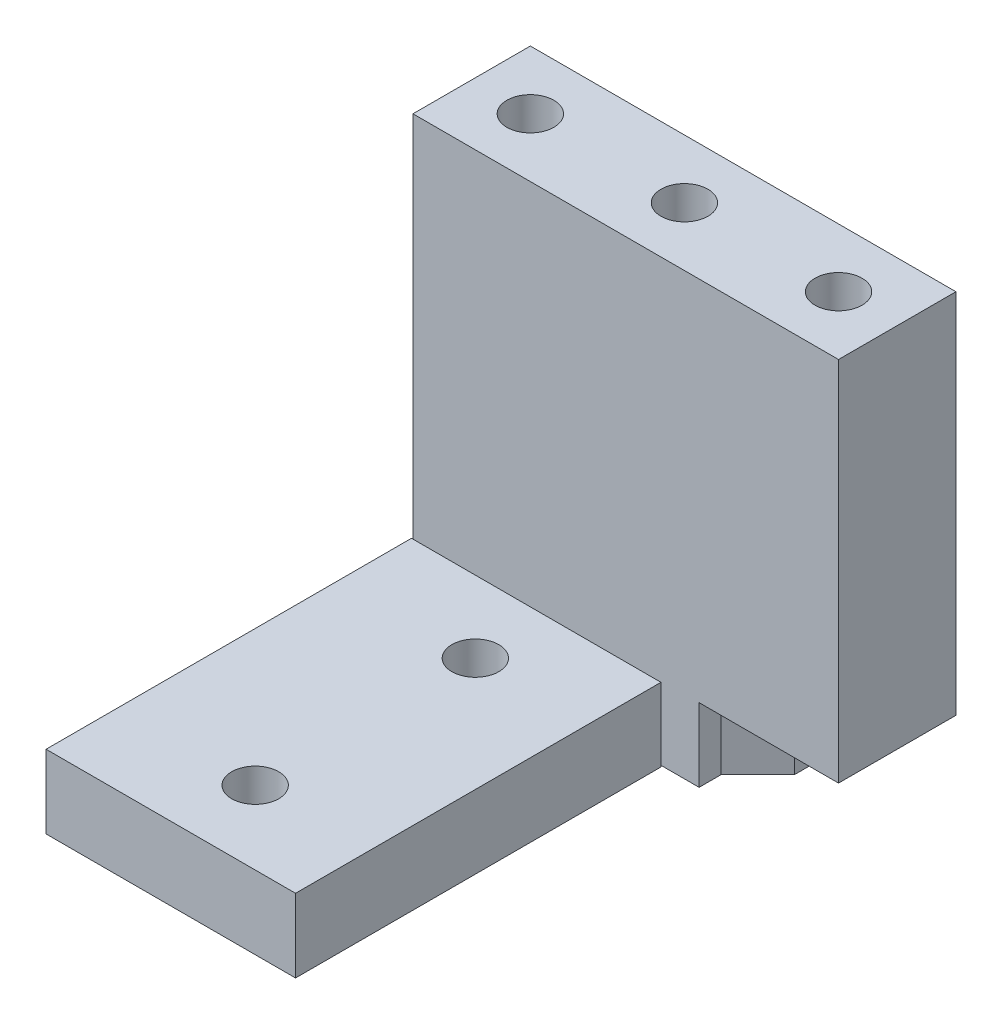
ISO-10303-21;
HEADER;
FILE_DESCRIPTION(('STEP AP214'),'2;1');
FILE_NAME('part.step','',(''),(''),'','','');
FILE_SCHEMA(('AUTOMOTIVE_DESIGN { 1 0 10303 214 1 1 1 1 }'));
ENDSEC;
DATA;
#1=APPLICATION_CONTEXT('core data for automotive mechanical design processes');
#2=APPLICATION_PROTOCOL_DEFINITION('international standard','automotive_design',2000,#1);
#3=PRODUCT_CONTEXT('',#1,'mechanical');
#4=PRODUCT('Part','Part','',(#3));
#5=PRODUCT_RELATED_PRODUCT_CATEGORY('part','',(#4));
#6=PRODUCT_DEFINITION_FORMATION('','',#4);
#7=PRODUCT_DEFINITION_CONTEXT('part definition',#1,'design');
#8=PRODUCT_DEFINITION('design','',#6,#7);
#9=PRODUCT_DEFINITION_SHAPE('','',#8);
#10=(LENGTH_UNIT() NAMED_UNIT(*) SI_UNIT(.MILLI.,.METRE.));
#11=(NAMED_UNIT(*) PLANE_ANGLE_UNIT() SI_UNIT($,.RADIAN.));
#12=(NAMED_UNIT(*) SI_UNIT($,.STERADIAN.) SOLID_ANGLE_UNIT());
#13=UNCERTAINTY_MEASURE_WITH_UNIT(LENGTH_MEASURE(1.E-05),#10,'distance_accuracy_value','');
#14=(GEOMETRIC_REPRESENTATION_CONTEXT(3) GLOBAL_UNCERTAINTY_ASSIGNED_CONTEXT((#13)) GLOBAL_UNIT_ASSIGNED_CONTEXT((#10,
#11,#12)) REPRESENTATION_CONTEXT('',''));
#15=CARTESIAN_POINT('',(0.,0.,0.));
#16=DIRECTION('',(0.,0.,1.));
#17=DIRECTION('',(1.,0.,0.));
#18=AXIS2_PLACEMENT_3D('',#15,#16,#17);
#19=CARTESIAN_POINT('',(0.,-15.,8.));
#20=DIRECTION('',(0.,-1.,0.));
#21=DIRECTION('',(1.,0.,0.));
#22=AXIS2_PLACEMENT_3D('',#19,#20,#21);
#23=PLANE('',#22);
#24=DIRECTION('',(-1.,0.,0.));
#25=VECTOR('',#24,1.);
#26=CARTESIAN_POINT('',(0.,-15.,8.));
#27=LINE('',#26,#25);
#28=CARTESIAN_POINT('',(5.,-15.,8.));
#29=VERTEX_POINT('',#28);
#30=CARTESIAN_POINT('',(-14.5,-15.,8.));
#31=VERTEX_POINT('',#30);
#32=EDGE_CURVE('E289',#29,#31,#27,.T.);
#33=ORIENTED_EDGE('',*,*,#32,.T.);
#34=DIRECTION('',(0.,0.,-1.));
#35=VECTOR('',#34,1.);
#36=CARTESIAN_POINT('',(-14.5,-15.,8.));
#37=LINE('',#36,#35);
#38=CARTESIAN_POINT('',(-14.5,-15.,0.));
#39=VERTEX_POINT('',#38);
#40=EDGE_CURVE('E340',#31,#39,#37,.T.);
#41=ORIENTED_EDGE('',*,*,#40,.T.);
#42=DIRECTION('',(-1.,0.,0.));
#43=VECTOR('',#42,1.);
#44=CARTESIAN_POINT('',(0.,-15.,0.));
#45=LINE('',#44,#43);
#46=CARTESIAN_POINT('',(7.50000000000001,-15.,0.));
#47=VERTEX_POINT('',#46);
#48=EDGE_CURVE('E250',#47,#39,#45,.T.);
#49=ORIENTED_EDGE('',*,*,#48,.F.);
#50=DIRECTION('',(0.,0.,-1.));
#51=VECTOR('',#50,1.);
#52=CARTESIAN_POINT('',(7.50000000000001,-15.,8.));
#53=LINE('',#52,#51);
#54=CARTESIAN_POINT('',(7.50000000000001,-15.,4.));
#55=VERTEX_POINT('',#54);
#56=EDGE_CURVE('E221',#55,#47,#53,.T.);
#57=ORIENTED_EDGE('',*,*,#56,.F.);
#58=DIRECTION('',(-0.707106781186544,0.,0.707106781186551));
#59=VECTOR('',#58,1.);
#60=CARTESIAN_POINT('',(5.75000000000004,-15.,5.74999999999998));
#61=LINE('',#60,#59);
#62=CARTESIAN_POINT('',(5.00000000000001,-15.,6.50000000000003));
#63=VERTEX_POINT('',#62);
#64=EDGE_CURVE('E337',#55,#63,#61,.T.);
#65=ORIENTED_EDGE('',*,*,#64,.T.);
#66=DIRECTION('',(0.,0.,1.));
#67=VECTOR('',#66,1.);
#68=CARTESIAN_POINT('',(5.00000000000001,-15.,0.));
#69=LINE('',#68,#67);
#70=EDGE_CURVE('E292',#63,#29,#69,.T.);
#71=ORIENTED_EDGE('',*,*,#70,.T.);
#72=EDGE_LOOP('',(#33,#41,#49,#57,#65,#71));
#73=FACE_BOUND('',#72,.T.);
#74=CARTESIAN_POINT('',(0.,-15.,4.));
#75=DIRECTION('',(0.,1.,0.));
#76=DIRECTION('',(0.,0.,1.));
#77=AXIS2_PLACEMENT_3D('',#74,#75,#76);
#78=CIRCLE('',#77,1.6);
#79=CARTESIAN_POINT('',(0.,-15.,5.6));
#80=VERTEX_POINT('',#79);
#81=EDGE_CURVE('E291',#80,#80,#78,.T.);
#82=ORIENTED_EDGE('',*,*,#81,.T.);
#83=EDGE_LOOP('',(#82));
#84=FACE_BOUND('',#83,.T.);
#85=CARTESIAN_POINT('',(-10.5,-15.,4.));
#86=DIRECTION('',(0.,1.,0.));
#87=DIRECTION('',(0.,0.,1.));
#88=AXIS2_PLACEMENT_3D('',#85,#86,#87);
#89=CIRCLE('',#88,1.6);
#90=CARTESIAN_POINT('',(-10.5,-15.,5.6));
#91=VERTEX_POINT('',#90);
#92=EDGE_CURVE('E294',#91,#91,#89,.T.);
#93=ORIENTED_EDGE('',*,*,#92,.T.);
#94=EDGE_LOOP('',(#93));
#95=FACE_BOUND('',#94,.T.);
#96=ADVANCED_FACE('F46',(#73,#84,#95),#23,.T.);
#97=CARTESIAN_POINT('',(0.,0.,8.));
#98=DIRECTION('',(0.,0.,1.));
#99=DIRECTION('',(1.,0.,0.));
#100=AXIS2_PLACEMENT_3D('',#97,#98,#99);
#101=PLANE('',#100);
#102=DIRECTION('',(0.,1.,0.));
#103=VECTOR('',#102,1.);
#104=CARTESIAN_POINT('',(-14.5,0.,8.));
#105=LINE('',#104,#103);
#106=CARTESIAN_POINT('',(-14.5,15.,8.));
#107=VERTEX_POINT('',#106);
#108=EDGE_CURVE('E236',#31,#107,#105,.T.);
#109=ORIENTED_EDGE('',*,*,#108,.F.);
#110=ORIENTED_EDGE('',*,*,#32,.F.);
#111=DIRECTION('',(0.,-1.,0.));
#112=VECTOR('',#111,1.);
#113=CARTESIAN_POINT('',(5.,-5.2830094339717,8.));
#114=LINE('',#113,#112);
#115=CARTESIAN_POINT('',(5.,-10.,8.));
#116=VERTEX_POINT('',#115);
#117=EDGE_CURVE('E332',#116,#29,#114,.T.);
#118=ORIENTED_EDGE('',*,*,#117,.F.);
#119=DIRECTION('',(-1.,0.,0.));
#120=VECTOR('',#119,1.);
#121=CARTESIAN_POINT('',(0.,-10.,8.));
#122=LINE('',#121,#120);
#123=CARTESIAN_POINT('',(14.5,-10.,8.));
#124=VERTEX_POINT('',#123);
#125=EDGE_CURVE('E210',#124,#116,#122,.T.);
#126=ORIENTED_EDGE('',*,*,#125,.F.);
#127=DIRECTION('',(0.,-1.,0.));
#128=VECTOR('',#127,1.);
#129=CARTESIAN_POINT('',(14.5,0.,8.));
#130=LINE('',#129,#128);
#131=CARTESIAN_POINT('',(14.5,15.,8.));
#132=VERTEX_POINT('',#131);
#133=EDGE_CURVE('E226',#132,#124,#130,.T.);
#134=ORIENTED_EDGE('',*,*,#133,.F.);
#135=DIRECTION('',(1.,0.,0.));
#136=VECTOR('',#135,1.);
#137=CARTESIAN_POINT('',(0.,15.,8.));
#138=LINE('',#137,#136);
#139=EDGE_CURVE('E230',#107,#132,#138,.T.);
#140=ORIENTED_EDGE('',*,*,#139,.F.);
#141=EDGE_LOOP('',(#109,#110,#118,#126,#134,#140));
#142=FACE_BOUND('',#141,.T.);
#143=ADVANCED_FACE('F432',(#142),#101,.T.);
#144=CARTESIAN_POINT('',(-14.5,0.,8.));
#145=DIRECTION('',(-1.,0.,0.));
#146=DIRECTION('',(0.,0.,1.));
#147=AXIS2_PLACEMENT_3D('',#144,#145,#146);
#148=PLANE('',#147);
#149=ORIENTED_EDGE('',*,*,#40,.F.);
#150=ORIENTED_EDGE('',*,*,#108,.T.);
#151=DIRECTION('',(0.,0.,-1.));
#152=VECTOR('',#151,1.);
#153=CARTESIAN_POINT('',(-14.5,15.,8.));
#154=LINE('',#153,#152);
#155=CARTESIAN_POINT('',(-14.5,15.,0.));
#156=VERTEX_POINT('',#155);
#157=EDGE_CURVE('E234',#107,#156,#154,.T.);
#158=ORIENTED_EDGE('',*,*,#157,.T.);
#159=DIRECTION('',(0.,1.,0.));
#160=VECTOR('',#159,1.);
#161=CARTESIAN_POINT('',(-14.5,0.,0.));
#162=LINE('',#161,#160);
#163=EDGE_CURVE('E241',#39,#156,#162,.T.);
#164=ORIENTED_EDGE('',*,*,#163,.F.);
#165=EDGE_LOOP('',(#149,#150,#158,#164));
#166=FACE_BOUND('',#165,.T.);
#167=ADVANCED_FACE('F428',(#166),#148,.T.);
#168=CARTESIAN_POINT('',(7.5,0.,8.));
#169=DIRECTION('',(1.,0.,0.));
#170=DIRECTION('',(0.,1.,0.));
#171=AXIS2_PLACEMENT_3D('',#168,#169,#170);
#172=PLANE('',#171);
#173=DIRECTION('',(0.,0.,-1.));
#174=VECTOR('',#173,1.);
#175=CARTESIAN_POINT('',(7.5,-10.,8.));
#176=LINE('',#175,#174);
#177=CARTESIAN_POINT('',(7.5,-10.,4.));
#178=VERTEX_POINT('',#177);
#179=CARTESIAN_POINT('',(7.5,-10.,0.));
#180=VERTEX_POINT('',#179);
#181=EDGE_CURVE('E224',#178,#180,#176,.T.);
#182=ORIENTED_EDGE('',*,*,#181,.F.);
#183=DIRECTION('',(0.,-1.,0.));
#184=VECTOR('',#183,1.);
#185=CARTESIAN_POINT('',(7.5,-5.2830094339717,4.));
#186=LINE('',#185,#184);
#187=EDGE_CURVE('E223',#178,#55,#186,.T.);
#188=ORIENTED_EDGE('',*,*,#187,.T.);
#189=ORIENTED_EDGE('',*,*,#56,.T.);
#190=DIRECTION('',(0.,-1.,0.));
#191=VECTOR('',#190,1.);
#192=CARTESIAN_POINT('',(7.5,0.,0.));
#193=LINE('',#192,#191);
#194=EDGE_CURVE('E247',#180,#47,#193,.T.);
#195=ORIENTED_EDGE('',*,*,#194,.F.);
#196=EDGE_LOOP('',(#182,#188,#189,#195));
#197=FACE_BOUND('',#196,.T.);
#198=ADVANCED_FACE('F443',(#197),#172,.T.);
#199=CARTESIAN_POINT('',(3.25,-3.69,8.));
#200=DIRECTION('',(0.,0.,-1.));
#201=DIRECTION('',(-1.,0.,0.));
#202=AXIS2_PLACEMENT_3D('',#199,#200,#201);
#203=CYLINDRICAL_SURFACE('',#202,0.500000000000001);
#204=DIRECTION('',(0.,0.,-1.));
#205=VECTOR('',#204,1.);
#206=CARTESIAN_POINT('',(3.75,-3.69,8.));
#207=LINE('',#206,#205);
#208=CARTESIAN_POINT('',(3.75,-3.69,6.5));
#209=VERTEX_POINT('',#208);
#210=CARTESIAN_POINT('',(3.75,-3.69,0.));
#211=VERTEX_POINT('',#210);
#212=EDGE_CURVE('E219',#209,#211,#207,.T.);
#213=ORIENTED_EDGE('',*,*,#212,.F.);
#214=CARTESIAN_POINT('',(3.25,-3.69,6.5));
#215=DIRECTION('',(0.,0.,1.));
#216=DIRECTION('',(1.,0.,0.));
#217=AXIS2_PLACEMENT_3D('',#214,#215,#216);
#218=CIRCLE('',#217,0.500000000000001);
#219=CARTESIAN_POINT('',(2.75,-3.69,6.5));
#220=VERTEX_POINT('',#219);
#221=EDGE_CURVE('E220',#209,#220,#218,.T.);
#222=ORIENTED_EDGE('',*,*,#221,.T.);
#223=DIRECTION('',(0.,0.,-1.));
#224=VECTOR('',#223,1.);
#225=CARTESIAN_POINT('',(2.75,-3.69,8.));
#226=LINE('',#225,#224);
#227=CARTESIAN_POINT('',(2.75,-3.69,0.));
#228=VERTEX_POINT('',#227);
#229=EDGE_CURVE('E204',#220,#228,#226,.T.);
#230=ORIENTED_EDGE('',*,*,#229,.T.);
#231=CARTESIAN_POINT('',(3.25,-3.69,0.));
#232=DIRECTION('',(0.,0.,1.));
#233=DIRECTION('',(1.,0.,0.));
#234=AXIS2_PLACEMENT_3D('',#231,#232,#233);
#235=CIRCLE('',#234,0.500000000000001);
#236=EDGE_CURVE('E233',#211,#228,#235,.T.);
#237=ORIENTED_EDGE('',*,*,#236,.F.);
#238=EDGE_LOOP('',(#213,#222,#230,#237));
#239=FACE_BOUND('',#238,.T.);
#240=ADVANCED_FACE('F394',(#239),#203,.F.);
#241=CARTESIAN_POINT('',(3.75,0.,8.));
#242=DIRECTION('',(1.,0.,0.));
#243=DIRECTION('',(0.,1.,0.));
#244=AXIS2_PLACEMENT_3D('',#241,#242,#243);
#245=PLANE('',#244);
#246=DIRECTION('',(0.,-1.,0.));
#247=VECTOR('',#246,1.);
#248=CARTESIAN_POINT('',(3.75,0.,6.5));
#249=LINE('',#248,#247);
#250=CARTESIAN_POINT('',(3.75,-10.31,6.5));
#251=VERTEX_POINT('',#250);
#252=EDGE_CURVE('E315',#209,#251,#249,.T.);
#253=ORIENTED_EDGE('',*,*,#252,.F.);
#254=ORIENTED_EDGE('',*,*,#212,.T.);
#255=DIRECTION('',(0.,-1.,0.));
#256=VECTOR('',#255,1.);
#257=CARTESIAN_POINT('',(3.75,0.,0.));
#258=LINE('',#257,#256);
#259=CARTESIAN_POINT('',(3.75,-10.31,0.));
#260=VERTEX_POINT('',#259);
#261=EDGE_CURVE('E279',#211,#260,#258,.T.);
#262=ORIENTED_EDGE('',*,*,#261,.T.);
#263=DIRECTION('',(0.,0.,-1.));
#264=VECTOR('',#263,1.);
#265=CARTESIAN_POINT('',(3.75,-10.31,8.));
#266=LINE('',#265,#264);
#267=EDGE_CURVE('E303',#251,#260,#266,.T.);
#268=ORIENTED_EDGE('',*,*,#267,.F.);
#269=EDGE_LOOP('',(#253,#254,#262,#268));
#270=FACE_BOUND('',#269,.T.);
#271=ADVANCED_FACE('F390',(#270),#245,.F.);
#272=CARTESIAN_POINT('',(3.25,-10.31,8.));
#273=DIRECTION('',(0.,0.,-1.));
#274=DIRECTION('',(-1.,0.,0.));
#275=AXIS2_PLACEMENT_3D('',#272,#273,#274);
#276=CYLINDRICAL_SURFACE('',#275,0.500000000000001);
#277=DIRECTION('',(0.,0.,-1.));
#278=VECTOR('',#277,1.);
#279=CARTESIAN_POINT('',(2.75,-10.31,8.));
#280=LINE('',#279,#278);
#281=CARTESIAN_POINT('',(2.75,-10.31,6.5));
#282=VERTEX_POINT('',#281);
#283=CARTESIAN_POINT('',(2.75,-10.31,0.));
#284=VERTEX_POINT('',#283);
#285=EDGE_CURVE('E276',#282,#284,#280,.T.);
#286=ORIENTED_EDGE('',*,*,#285,.F.);
#287=CARTESIAN_POINT('',(3.25,-10.31,6.5));
#288=DIRECTION('',(0.,0.,1.));
#289=DIRECTION('',(1.,0.,0.));
#290=AXIS2_PLACEMENT_3D('',#287,#288,#289);
#291=CIRCLE('',#290,0.500000000000001);
#292=EDGE_CURVE('E282',#282,#251,#291,.T.);
#293=ORIENTED_EDGE('',*,*,#292,.T.);
#294=ORIENTED_EDGE('',*,*,#267,.T.);
#295=CARTESIAN_POINT('',(3.25,-10.31,0.));
#296=DIRECTION('',(0.,0.,1.));
#297=DIRECTION('',(1.,0.,0.));
#298=AXIS2_PLACEMENT_3D('',#295,#296,#297);
#299=CIRCLE('',#298,0.500000000000001);
#300=EDGE_CURVE('E256',#284,#260,#299,.T.);
#301=ORIENTED_EDGE('',*,*,#300,.F.);
#302=EDGE_LOOP('',(#286,#293,#294,#301));
#303=FACE_BOUND('',#302,.T.);
#304=ADVANCED_FACE('F385',(#303),#276,.F.);
#305=CARTESIAN_POINT('',(0.,-10.31,8.));
#306=DIRECTION('',(0.,-1.,0.));
#307=DIRECTION('',(0.,0.,-1.));
#308=AXIS2_PLACEMENT_3D('',#305,#306,#307);
#309=PLANE('',#308);
#310=CARTESIAN_POINT('',(0.,-10.31,4.));
#311=DIRECTION('',(0.,-1.,0.));
#312=DIRECTION('',(0.,0.,-1.));
#313=AXIS2_PLACEMENT_3D('',#310,#311,#312);
#314=CIRCLE('',#313,1.6);
#315=CARTESIAN_POINT('',(0.,-10.31,2.4));
#316=VERTEX_POINT('',#315);
#317=EDGE_CURVE('E300',#316,#316,#314,.T.);
#318=ORIENTED_EDGE('',*,*,#317,.T.);
#319=EDGE_LOOP('',(#318));
#320=FACE_BOUND('',#319,.T.);
#321=DIRECTION('',(-1.,0.,0.));
#322=VECTOR('',#321,1.);
#323=CARTESIAN_POINT('',(0.,-10.31,6.5));
#324=LINE('',#323,#322);
#325=CARTESIAN_POINT('',(-7.05,-10.31,6.5));
#326=VERTEX_POINT('',#325);
#327=EDGE_CURVE('E317',#282,#326,#324,.T.);
#328=ORIENTED_EDGE('',*,*,#327,.F.);
#329=ORIENTED_EDGE('',*,*,#285,.T.);
#330=DIRECTION('',(-1.,0.,0.));
#331=VECTOR('',#330,1.);
#332=CARTESIAN_POINT('',(0.,-10.31,0.));
#333=LINE('',#332,#331);
#334=CARTESIAN_POINT('',(-7.05,-10.31,0.));
#335=VERTEX_POINT('',#334);
#336=EDGE_CURVE('E273',#284,#335,#333,.T.);
#337=ORIENTED_EDGE('',*,*,#336,.T.);
#338=DIRECTION('',(0.,0.,-1.));
#339=VECTOR('',#338,1.);
#340=CARTESIAN_POINT('',(-7.05,-10.31,8.));
#341=LINE('',#340,#339);
#342=EDGE_CURVE('E272',#326,#335,#341,.T.);
#343=ORIENTED_EDGE('',*,*,#342,.F.);
#344=EDGE_LOOP('',(#328,#329,#337,#343));
#345=FACE_BOUND('',#344,.T.);
#346=ADVANCED_FACE('F396',(#320,#345),#309,.F.);
#347=CARTESIAN_POINT('',(-7.04999999999999,0.,8.));
#348=DIRECTION('',(-1.,0.,0.));
#349=DIRECTION('',(0.,-1.,0.));
#350=AXIS2_PLACEMENT_3D('',#347,#348,#349);
#351=PLANE('',#350);
#352=DIRECTION('',(0.,1.,0.));
#353=VECTOR('',#352,1.);
#354=CARTESIAN_POINT('',(-7.04999999999999,0.,6.5));
#355=LINE('',#354,#353);
#356=CARTESIAN_POINT('',(-7.05,-9.46,6.5));
#357=VERTEX_POINT('',#356);
#358=EDGE_CURVE('E322',#326,#357,#355,.T.);
#359=ORIENTED_EDGE('',*,*,#358,.F.);
#360=ORIENTED_EDGE('',*,*,#342,.T.);
#361=DIRECTION('',(0.,1.,0.));
#362=VECTOR('',#361,1.);
#363=CARTESIAN_POINT('',(-7.04999999999999,0.,0.));
#364=LINE('',#363,#362);
#365=CARTESIAN_POINT('',(-7.05,-9.46,0.));
#366=VERTEX_POINT('',#365);
#367=EDGE_CURVE('E268',#335,#366,#364,.T.);
#368=ORIENTED_EDGE('',*,*,#367,.T.);
#369=DIRECTION('',(0.,0.,-1.));
#370=VECTOR('',#369,1.);
#371=CARTESIAN_POINT('',(-7.05,-9.46,8.));
#372=LINE('',#371,#370);
#373=EDGE_CURVE('E267',#357,#366,#372,.T.);
#374=ORIENTED_EDGE('',*,*,#373,.F.);
#375=EDGE_LOOP('',(#359,#360,#368,#374));
#376=FACE_BOUND('',#375,.T.);
#377=ADVANCED_FACE('F377',(#376),#351,.F.);
#378=CARTESIAN_POINT('',(0.,-9.46,8.));
#379=DIRECTION('',(0.,1.,0.));
#380=DIRECTION('',(0.,0.,1.));
#381=AXIS2_PLACEMENT_3D('',#378,#379,#380);
#382=PLANE('',#381);
#383=CARTESIAN_POINT('',(0.,-9.46,4.));
#384=DIRECTION('',(0.,1.,0.));
#385=DIRECTION('',(0.,0.,1.));
#386=AXIS2_PLACEMENT_3D('',#383,#384,#385);
#387=CIRCLE('',#386,1.6);
#388=CARTESIAN_POINT('',(0.,-9.46,5.6));
#389=VERTEX_POINT('',#388);
#390=EDGE_CURVE('E271',#389,#389,#387,.T.);
#391=ORIENTED_EDGE('',*,*,#390,.T.);
#392=EDGE_LOOP('',(#391));
#393=FACE_BOUND('',#392,.T.);
#394=DIRECTION('',(1.,0.,0.));
#395=VECTOR('',#394,1.);
#396=CARTESIAN_POINT('',(0.,-9.46,0.));
#397=LINE('',#396,#395);
#398=CARTESIAN_POINT('',(2.7,-9.46,0.));
#399=VERTEX_POINT('',#398);
#400=EDGE_CURVE('E265',#366,#399,#397,.T.);
#401=ORIENTED_EDGE('',*,*,#400,.T.);
#402=DIRECTION('',(0.,0.,-1.));
#403=VECTOR('',#402,1.);
#404=CARTESIAN_POINT('',(2.7,-9.46,8.));
#405=LINE('',#404,#403);
#406=CARTESIAN_POINT('',(2.7,-9.46,6.5));
#407=VERTEX_POINT('',#406);
#408=EDGE_CURVE('E61',#399,#407,#405,.F.);
#409=ORIENTED_EDGE('',*,*,#408,.T.);
#410=DIRECTION('',(1.,0.,0.));
#411=VECTOR('',#410,1.);
#412=CARTESIAN_POINT('',(0.,-9.46,6.5));
#413=LINE('',#412,#411);
#414=EDGE_CURVE('E324',#357,#407,#413,.T.);
#415=ORIENTED_EDGE('',*,*,#414,.F.);
#416=ORIENTED_EDGE('',*,*,#373,.T.);
#417=EDGE_LOOP('',(#401,#409,#415,#416));
#418=FACE_BOUND('',#417,.T.);
#419=ADVANCED_FACE('F373',(#393,#418),#382,.F.);
#420=CARTESIAN_POINT('',(2.9,0.,8.));
#421=DIRECTION('',(-1.,0.,0.));
#422=DIRECTION('',(0.,-1.,0.));
#423=AXIS2_PLACEMENT_3D('',#420,#421,#422);
#424=PLANE('',#423);
#425=DIRECTION('',(0.,1.,0.));
#426=VECTOR('',#425,1.);
#427=CARTESIAN_POINT('',(2.9,0.,0.));
#428=LINE('',#427,#426);
#429=CARTESIAN_POINT('',(2.9,-9.26,0.));
#430=VERTEX_POINT('',#429);
#431=CARTESIAN_POINT('',(2.9,-4.74,0.));
#432=VERTEX_POINT('',#431);
#433=EDGE_CURVE('E263',#430,#432,#428,.T.);
#434=ORIENTED_EDGE('',*,*,#433,.T.);
#435=DIRECTION('',(0.,0.,-1.));
#436=VECTOR('',#435,1.);
#437=CARTESIAN_POINT('',(2.9,-4.74,8.));
#438=LINE('',#437,#436);
#439=CARTESIAN_POINT('',(2.9,-4.74,6.5));
#440=VERTEX_POINT('',#439);
#441=EDGE_CURVE('E69',#432,#440,#438,.F.);
#442=ORIENTED_EDGE('',*,*,#441,.T.);
#443=DIRECTION('',(0.,1.,0.));
#444=VECTOR('',#443,1.);
#445=CARTESIAN_POINT('',(2.9,0.,6.5));
#446=LINE('',#445,#444);
#447=CARTESIAN_POINT('',(2.9,-9.26,6.5));
#448=VERTEX_POINT('',#447);
#449=EDGE_CURVE('E326',#448,#440,#446,.T.);
#450=ORIENTED_EDGE('',*,*,#449,.F.);
#451=DIRECTION('',(0.,0.,-1.));
#452=VECTOR('',#451,1.);
#453=CARTESIAN_POINT('',(2.9,-9.26,8.));
#454=LINE('',#453,#452);
#455=EDGE_CURVE('E352',#448,#430,#454,.T.);
#456=ORIENTED_EDGE('',*,*,#455,.T.);
#457=EDGE_LOOP('',(#434,#442,#450,#456));
#458=FACE_BOUND('',#457,.T.);
#459=ADVANCED_FACE('F367',(#458),#424,.F.);
#460=CARTESIAN_POINT('',(0.,-4.54,8.));
#461=DIRECTION('',(0.,-1.,0.));
#462=DIRECTION('',(1.,0.,0.));
#463=AXIS2_PLACEMENT_3D('',#460,#461,#462);
#464=PLANE('',#463);
#465=CARTESIAN_POINT('',(0.,-4.54,4.));
#466=DIRECTION('',(0.,-1.,0.));
#467=DIRECTION('',(1.,0.,0.));
#468=AXIS2_PLACEMENT_3D('',#465,#466,#467);
#469=CIRCLE('',#468,1.6);
#470=CARTESIAN_POINT('',(1.6,-4.54,4.));
#471=VERTEX_POINT('',#470);
#472=EDGE_CURVE('E262',#471,#471,#469,.T.);
#473=ORIENTED_EDGE('',*,*,#472,.T.);
#474=EDGE_LOOP('',(#473));
#475=FACE_BOUND('',#474,.T.);
#476=DIRECTION('',(-1.,0.,0.));
#477=VECTOR('',#476,1.);
#478=CARTESIAN_POINT('',(0.,-4.54,6.5));
#479=LINE('',#478,#477);
#480=CARTESIAN_POINT('',(2.7,-4.54,6.5));
#481=VERTEX_POINT('',#480);
#482=CARTESIAN_POINT('',(-7.05,-4.54,6.5));
#483=VERTEX_POINT('',#482);
#484=EDGE_CURVE('E191',#481,#483,#479,.T.);
#485=ORIENTED_EDGE('',*,*,#484,.F.);
#486=DIRECTION('',(0.,0.,-1.));
#487=VECTOR('',#486,1.);
#488=CARTESIAN_POINT('',(2.7,-4.54,8.));
#489=LINE('',#488,#487);
#490=CARTESIAN_POINT('',(2.7,-4.54,0.));
#491=VERTEX_POINT('',#490);
#492=EDGE_CURVE('E336',#481,#491,#489,.T.);
#493=ORIENTED_EDGE('',*,*,#492,.T.);
#494=DIRECTION('',(-1.,0.,0.));
#495=VECTOR('',#494,1.);
#496=CARTESIAN_POINT('',(0.,-4.54,0.));
#497=LINE('',#496,#495);
#498=CARTESIAN_POINT('',(-7.05,-4.54,0.));
#499=VERTEX_POINT('',#498);
#500=EDGE_CURVE('E260',#491,#499,#497,.T.);
#501=ORIENTED_EDGE('',*,*,#500,.T.);
#502=DIRECTION('',(0.,0.,-1.));
#503=VECTOR('',#502,1.);
#504=CARTESIAN_POINT('',(-7.05,-4.54,8.));
#505=LINE('',#504,#503);
#506=EDGE_CURVE('E216',#483,#499,#505,.T.);
#507=ORIENTED_EDGE('',*,*,#506,.F.);
#508=EDGE_LOOP('',(#485,#493,#501,#507));
#509=FACE_BOUND('',#508,.T.);
#510=ADVANCED_FACE('F360',(#475,#509),#464,.F.);
#511=CARTESIAN_POINT('',(-7.05,0.,8.));
#512=DIRECTION('',(-1.,0.,0.));
#513=DIRECTION('',(0.,0.,1.));
#514=AXIS2_PLACEMENT_3D('',#511,#512,#513);
#515=PLANE('',#514);
#516=DIRECTION('',(0.,1.,0.));
#517=VECTOR('',#516,1.);
#518=CARTESIAN_POINT('',(-7.05,0.,6.5));
#519=LINE('',#518,#517);
#520=CARTESIAN_POINT('',(-7.05,-3.69,6.5));
#521=VERTEX_POINT('',#520);
#522=EDGE_CURVE('E185',#483,#521,#519,.T.);
#523=ORIENTED_EDGE('',*,*,#522,.F.);
#524=ORIENTED_EDGE('',*,*,#506,.T.);
#525=DIRECTION('',(0.,1.,0.));
#526=VECTOR('',#525,1.);
#527=CARTESIAN_POINT('',(-7.05,0.,0.));
#528=LINE('',#527,#526);
#529=CARTESIAN_POINT('',(-7.05,-3.69,0.));
#530=VERTEX_POINT('',#529);
#531=EDGE_CURVE('E205',#499,#530,#528,.T.);
#532=ORIENTED_EDGE('',*,*,#531,.T.);
#533=DIRECTION('',(0.,0.,-1.));
#534=VECTOR('',#533,1.);
#535=CARTESIAN_POINT('',(-7.05,-3.69,8.));
#536=LINE('',#535,#534);
#537=EDGE_CURVE('E202',#521,#530,#536,.T.);
#538=ORIENTED_EDGE('',*,*,#537,.F.);
#539=EDGE_LOOP('',(#523,#524,#532,#538));
#540=FACE_BOUND('',#539,.T.);
#541=ADVANCED_FACE('F207',(#540),#515,.F.);
#542=CARTESIAN_POINT('',(0.,-3.69,8.));
#543=DIRECTION('',(0.,-1.,0.));
#544=DIRECTION('',(1.,0.,0.));
#545=AXIS2_PLACEMENT_3D('',#542,#543,#544);
#546=PLANE('',#545);
#547=CARTESIAN_POINT('',(0.,-3.69,4.));
#548=DIRECTION('',(0.,-1.,0.));
#549=DIRECTION('',(1.,0.,0.));
#550=AXIS2_PLACEMENT_3D('',#547,#548,#549);
#551=CIRCLE('',#550,1.6);
#552=CARTESIAN_POINT('',(1.6,-3.69,4.));
#553=VERTEX_POINT('',#552);
#554=EDGE_CURVE('E253',#553,#553,#551,.T.);
#555=ORIENTED_EDGE('',*,*,#554,.F.);
#556=EDGE_LOOP('',(#555));
#557=FACE_BOUND('',#556,.T.);
#558=ORIENTED_EDGE('',*,*,#229,.F.);
#559=DIRECTION('',(-1.,0.,0.));
#560=VECTOR('',#559,1.);
#561=CARTESIAN_POINT('',(0.,-3.69,6.5));
#562=LINE('',#561,#560);
#563=EDGE_CURVE('E188',#220,#521,#562,.T.);
#564=ORIENTED_EDGE('',*,*,#563,.T.);
#565=ORIENTED_EDGE('',*,*,#537,.T.);
#566=DIRECTION('',(-1.,0.,0.));
#567=VECTOR('',#566,1.);
#568=CARTESIAN_POINT('',(0.,-3.69,0.));
#569=LINE('',#568,#567);
#570=EDGE_CURVE('E257',#228,#530,#569,.T.);
#571=ORIENTED_EDGE('',*,*,#570,.F.);
#572=EDGE_LOOP('',(#558,#564,#565,#571));
#573=FACE_BOUND('',#572,.T.);
#574=ADVANCED_FACE('F200',(#557,#573),#546,.T.);
#575=CARTESIAN_POINT('',(0.,-10.,8.));
#576=DIRECTION('',(0.,-1.,0.));
#577=DIRECTION('',(1.,0.,0.));
#578=AXIS2_PLACEMENT_3D('',#575,#576,#577);
#579=PLANE('',#578);
#580=CARTESIAN_POINT('',(10.5,-10.,4.));
#581=DIRECTION('',(0.,-1.,0.));
#582=DIRECTION('',(1.,0.,0.));
#583=AXIS2_PLACEMENT_3D('',#580,#581,#582);
#584=CIRCLE('',#583,1.6);
#585=CARTESIAN_POINT('',(12.1,-10.,4.));
#586=VERTEX_POINT('',#585);
#587=EDGE_CURVE('E295',#586,#586,#584,.T.);
#588=ORIENTED_EDGE('',*,*,#587,.F.);
#589=EDGE_LOOP('',(#588));
#590=FACE_BOUND('',#589,.T.);
#591=DIRECTION('',(-1.,0.,0.));
#592=VECTOR('',#591,1.);
#593=CARTESIAN_POINT('',(0.,-10.,0.));
#594=LINE('',#593,#592);
#595=CARTESIAN_POINT('',(14.5,-10.,0.));
#596=VERTEX_POINT('',#595);
#597=EDGE_CURVE('E244',#596,#180,#594,.T.);
#598=ORIENTED_EDGE('',*,*,#597,.F.);
#599=DIRECTION('',(0.,0.,-1.));
#600=VECTOR('',#599,1.);
#601=CARTESIAN_POINT('',(14.5,-10.,8.));
#602=LINE('',#601,#600);
#603=EDGE_CURVE('E228',#124,#596,#602,.T.);
#604=ORIENTED_EDGE('',*,*,#603,.F.);
#605=ORIENTED_EDGE('',*,*,#125,.T.);
#606=DIRECTION('',(0.,0.,-1.));
#607=VECTOR('',#606,1.);
#608=CARTESIAN_POINT('',(5.00000000000001,-10.,0.));
#609=LINE('',#608,#607);
#610=CARTESIAN_POINT('',(5.,-10.,6.50000000000003));
#611=VERTEX_POINT('',#610);
#612=EDGE_CURVE('E212',#116,#611,#609,.T.);
#613=ORIENTED_EDGE('',*,*,#612,.T.);
#614=DIRECTION('',(0.707106781186544,0.,-0.707106781186551));
#615=VECTOR('',#614,1.);
#616=CARTESIAN_POINT('',(5.75000000000004,-10.,5.74999999999998));
#617=LINE('',#616,#615);
#618=EDGE_CURVE('E227',#611,#178,#617,.T.);
#619=ORIENTED_EDGE('',*,*,#618,.T.);
#620=ORIENTED_EDGE('',*,*,#181,.T.);
#621=EDGE_LOOP('',(#598,#604,#605,#613,#619,#620));
#622=FACE_BOUND('',#621,.T.);
#623=ADVANCED_FACE('F439',(#590,#622),#579,.T.);
#624=CARTESIAN_POINT('',(14.5,0.,8.));
#625=DIRECTION('',(1.,0.,0.));
#626=DIRECTION('',(0.,1.,0.));
#627=AXIS2_PLACEMENT_3D('',#624,#625,#626);
#628=PLANE('',#627);
#629=DIRECTION('',(0.,-1.,0.));
#630=VECTOR('',#629,1.);
#631=CARTESIAN_POINT('',(14.5,0.,0.));
#632=LINE('',#631,#630);
#633=CARTESIAN_POINT('',(14.5,15.,0.));
#634=VERTEX_POINT('',#633);
#635=EDGE_CURVE('E240',#634,#596,#632,.T.);
#636=ORIENTED_EDGE('',*,*,#635,.F.);
#637=DIRECTION('',(0.,0.,-1.));
#638=VECTOR('',#637,1.);
#639=CARTESIAN_POINT('',(14.5,15.,8.));
#640=LINE('',#639,#638);
#641=EDGE_CURVE('E231',#132,#634,#640,.T.);
#642=ORIENTED_EDGE('',*,*,#641,.F.);
#643=ORIENTED_EDGE('',*,*,#133,.T.);
#644=ORIENTED_EDGE('',*,*,#603,.T.);
#645=EDGE_LOOP('',(#636,#642,#643,#644));
#646=FACE_BOUND('',#645,.T.);
#647=ADVANCED_FACE('F414',(#646),#628,.T.);
#648=CARTESIAN_POINT('',(0.,15.,8.));
#649=DIRECTION('',(0.,1.,0.));
#650=DIRECTION('',(0.,0.,1.));
#651=AXIS2_PLACEMENT_3D('',#648,#649,#650);
#652=PLANE('',#651);
#653=CARTESIAN_POINT('',(-10.5,15.,4.));
#654=DIRECTION('',(0.,1.,0.));
#655=DIRECTION('',(0.,0.,1.));
#656=AXIS2_PLACEMENT_3D('',#653,#654,#655);
#657=CIRCLE('',#656,1.6);
#658=CARTESIAN_POINT('',(-10.5,15.,5.6));
#659=VERTEX_POINT('',#658);
#660=EDGE_CURVE('E318',#659,#659,#657,.T.);
#661=ORIENTED_EDGE('',*,*,#660,.F.);
#662=EDGE_LOOP('',(#661));
#663=FACE_BOUND('',#662,.T.);
#664=CARTESIAN_POINT('',(10.5,15.,4.));
#665=DIRECTION('',(0.,1.,0.));
#666=DIRECTION('',(0.,0.,1.));
#667=AXIS2_PLACEMENT_3D('',#664,#665,#666);
#668=CIRCLE('',#667,1.6);
#669=CARTESIAN_POINT('',(10.5,15.,5.6));
#670=VERTEX_POINT('',#669);
#671=EDGE_CURVE('E298',#670,#670,#668,.T.);
#672=ORIENTED_EDGE('',*,*,#671,.F.);
#673=EDGE_LOOP('',(#672));
#674=FACE_BOUND('',#673,.T.);
#675=CARTESIAN_POINT('',(0.,15.,4.));
#676=DIRECTION('',(0.,1.,0.));
#677=DIRECTION('',(0.,0.,1.));
#678=AXIS2_PLACEMENT_3D('',#675,#676,#677);
#679=CIRCLE('',#678,1.6);
#680=CARTESIAN_POINT('',(0.,15.,5.6));
#681=VERTEX_POINT('',#680);
#682=EDGE_CURVE('E299',#681,#681,#679,.T.);
#683=ORIENTED_EDGE('',*,*,#682,.F.);
#684=EDGE_LOOP('',(#683));
#685=FACE_BOUND('',#684,.T.);
#686=DIRECTION('',(1.,0.,0.));
#687=VECTOR('',#686,1.);
#688=CARTESIAN_POINT('',(0.,15.,0.));
#689=LINE('',#688,#687);
#690=EDGE_CURVE('E237',#156,#634,#689,.T.);
#691=ORIENTED_EDGE('',*,*,#690,.F.);
#692=ORIENTED_EDGE('',*,*,#157,.F.);
#693=ORIENTED_EDGE('',*,*,#139,.T.);
#694=ORIENTED_EDGE('',*,*,#641,.T.);
#695=EDGE_LOOP('',(#691,#692,#693,#694));
#696=FACE_BOUND('',#695,.T.);
#697=ADVANCED_FACE('F411',(#663,#674,#685,#696),#652,.T.);
#698=CARTESIAN_POINT('',(0.,0.,0.));
#699=DIRECTION('',(0.,0.,1.));
#700=DIRECTION('',(1.,0.,0.));
#701=AXIS2_PLACEMENT_3D('',#698,#699,#700);
#702=PLANE('',#701);
#703=ORIENTED_EDGE('',*,*,#500,.F.);
#704=CARTESIAN_POINT('',(2.7,-4.74,0.));
#705=DIRECTION('',(0.,0.,1.));
#706=DIRECTION('',(1.,0.,0.));
#707=AXIS2_PLACEMENT_3D('',#704,#705,#706);
#708=CIRCLE('',#707,0.2);
#709=EDGE_CURVE('E350',#491,#432,#708,.F.);
#710=ORIENTED_EDGE('',*,*,#709,.T.);
#711=ORIENTED_EDGE('',*,*,#433,.F.);
#712=CARTESIAN_POINT('',(2.7,-9.26,0.));
#713=DIRECTION('',(0.,0.,1.));
#714=DIRECTION('',(1.,0.,0.));
#715=AXIS2_PLACEMENT_3D('',#712,#713,#714);
#716=CIRCLE('',#715,0.2);
#717=EDGE_CURVE('E348',#430,#399,#716,.F.);
#718=ORIENTED_EDGE('',*,*,#717,.T.);
#719=ORIENTED_EDGE('',*,*,#400,.F.);
#720=ORIENTED_EDGE('',*,*,#367,.F.);
#721=ORIENTED_EDGE('',*,*,#336,.F.);
#722=ORIENTED_EDGE('',*,*,#300,.T.);
#723=ORIENTED_EDGE('',*,*,#261,.F.);
#724=ORIENTED_EDGE('',*,*,#236,.T.);
#725=ORIENTED_EDGE('',*,*,#570,.T.);
#726=ORIENTED_EDGE('',*,*,#531,.F.);
#727=EDGE_LOOP('',(#703,#710,#711,#718,#719,#720,#721,#722,#723,#724,#725,#726));
#728=FACE_BOUND('',#727,.T.);
#729=ORIENTED_EDGE('',*,*,#163,.T.);
#730=ORIENTED_EDGE('',*,*,#690,.T.);
#731=ORIENTED_EDGE('',*,*,#635,.T.);
#732=ORIENTED_EDGE('',*,*,#597,.T.);
#733=ORIENTED_EDGE('',*,*,#194,.T.);
#734=ORIENTED_EDGE('',*,*,#48,.T.);
#735=EDGE_LOOP('',(#729,#730,#731,#732,#733,#734));
#736=FACE_BOUND('',#735,.T.);
#737=ADVANCED_FACE('F365',(#728,#736),#702,.F.);
#738=CARTESIAN_POINT('',(0.,-15.,4.));
#739=DIRECTION('',(0.,1.,0.));
#740=DIRECTION('',(0.,0.,1.));
#741=AXIS2_PLACEMENT_3D('',#738,#739,#740);
#742=CYLINDRICAL_SURFACE('',#741,1.6);
#743=ORIENTED_EDGE('',*,*,#554,.T.);
#744=EDGE_LOOP('',(#743));
#745=FACE_BOUND('',#744,.T.);
#746=ORIENTED_EDGE('',*,*,#682,.T.);
#747=EDGE_LOOP('',(#746));
#748=FACE_BOUND('',#747,.T.);
#749=ADVANCED_FACE('F499',(#745,#748),#742,.F.);
#750=CARTESIAN_POINT('',(10.5,-15.,4.));
#751=DIRECTION('',(0.,1.,0.));
#752=DIRECTION('',(0.,0.,1.));
#753=AXIS2_PLACEMENT_3D('',#750,#751,#752);
#754=CYLINDRICAL_SURFACE('',#753,1.6);
#755=ORIENTED_EDGE('',*,*,#587,.T.);
#756=EDGE_LOOP('',(#755));
#757=FACE_BOUND('',#756,.T.);
#758=ORIENTED_EDGE('',*,*,#671,.T.);
#759=EDGE_LOOP('',(#758));
#760=FACE_BOUND('',#759,.T.);
#761=ADVANCED_FACE('F566',(#757,#760),#754,.F.);
#762=CARTESIAN_POINT('',(-10.5,-15.,4.));
#763=DIRECTION('',(0.,1.,0.));
#764=DIRECTION('',(0.,0.,1.));
#765=AXIS2_PLACEMENT_3D('',#762,#763,#764);
#766=CYLINDRICAL_SURFACE('',#765,1.6);
#767=ORIENTED_EDGE('',*,*,#660,.T.);
#768=EDGE_LOOP('',(#767));
#769=FACE_BOUND('',#768,.T.);
#770=ORIENTED_EDGE('',*,*,#92,.F.);
#771=EDGE_LOOP('',(#770));
#772=FACE_BOUND('',#771,.T.);
#773=ADVANCED_FACE('F408',(#769,#772),#766,.F.);
#774=ORIENTED_EDGE('',*,*,#472,.F.);
#775=EDGE_LOOP('',(#774));
#776=FACE_BOUND('',#775,.T.);
#777=ORIENTED_EDGE('',*,*,#390,.F.);
#778=EDGE_LOOP('',(#777));
#779=FACE_BOUND('',#778,.T.);
#780=ADVANCED_FACE('F548',(#776,#779),#742,.F.);
#781=ORIENTED_EDGE('',*,*,#81,.F.);
#782=EDGE_LOOP('',(#781));
#783=FACE_BOUND('',#782,.T.);
#784=ORIENTED_EDGE('',*,*,#317,.F.);
#785=EDGE_LOOP('',(#784));
#786=FACE_BOUND('',#785,.T.);
#787=ADVANCED_FACE('F461',(#783,#786),#742,.F.);
#788=CARTESIAN_POINT('',(0.,0.,6.5));
#789=DIRECTION('',(0.,0.,1.));
#790=DIRECTION('',(1.,0.,0.));
#791=AXIS2_PLACEMENT_3D('',#788,#789,#790);
#792=PLANE('',#791);
#793=ORIENTED_EDGE('',*,*,#221,.F.);
#794=ORIENTED_EDGE('',*,*,#252,.T.);
#795=ORIENTED_EDGE('',*,*,#292,.F.);
#796=ORIENTED_EDGE('',*,*,#327,.T.);
#797=ORIENTED_EDGE('',*,*,#358,.T.);
#798=ORIENTED_EDGE('',*,*,#414,.T.);
#799=CARTESIAN_POINT('',(2.7,-9.26,6.5));
#800=DIRECTION('',(0.,0.,1.));
#801=DIRECTION('',(1.,0.,0.));
#802=AXIS2_PLACEMENT_3D('',#799,#800,#801);
#803=CIRCLE('',#802,0.2);
#804=EDGE_CURVE('E12',#407,#448,#803,.T.);
#805=ORIENTED_EDGE('',*,*,#804,.T.);
#806=ORIENTED_EDGE('',*,*,#449,.T.);
#807=CARTESIAN_POINT('',(2.7,-4.74,6.5));
#808=DIRECTION('',(0.,0.,1.));
#809=DIRECTION('',(1.,0.,0.));
#810=AXIS2_PLACEMENT_3D('',#807,#808,#809);
#811=CIRCLE('',#810,0.2);
#812=EDGE_CURVE('E54',#440,#481,#811,.T.);
#813=ORIENTED_EDGE('',*,*,#812,.T.);
#814=ORIENTED_EDGE('',*,*,#484,.T.);
#815=ORIENTED_EDGE('',*,*,#522,.T.);
#816=ORIENTED_EDGE('',*,*,#563,.F.);
#817=EDGE_LOOP('',(#793,#794,#795,#796,#797,#798,#805,#806,#813,#814,#815,#816));
#818=FACE_BOUND('',#817,.T.);
#819=ADVANCED_FACE('F187',(#818),#792,.F.);
#820=CARTESIAN_POINT('',(5.75000000000004,-5.2830094339717,5.74999999999998));
#821=DIRECTION('',(0.707106781186551,0.,0.707106781186544));
#822=DIRECTION('',(0.707106781186544,0.,-0.707106781186551));
#823=AXIS2_PLACEMENT_3D('',#820,#821,#822);
#824=PLANE('',#823);
#825=DIRECTION('',(0.,-1.,0.));
#826=VECTOR('',#825,1.);
#827=CARTESIAN_POINT('',(5.,-5.2830094339717,6.50000000000003));
#828=LINE('',#827,#826);
#829=EDGE_CURVE('E196',#611,#63,#828,.T.);
#830=ORIENTED_EDGE('',*,*,#829,.T.);
#831=ORIENTED_EDGE('',*,*,#64,.F.);
#832=ORIENTED_EDGE('',*,*,#187,.F.);
#833=ORIENTED_EDGE('',*,*,#618,.F.);
#834=EDGE_LOOP('',(#830,#831,#832,#833));
#835=FACE_BOUND('',#834,.T.);
#836=ADVANCED_FACE('F453',(#835),#824,.T.);
#837=CARTESIAN_POINT('',(5.00000000000001,-5.2830094339717,0.));
#838=DIRECTION('',(1.,0.,0.));
#839=DIRECTION('',(0.,0.,-1.));
#840=AXIS2_PLACEMENT_3D('',#837,#838,#839);
#841=PLANE('',#840);
#842=ORIENTED_EDGE('',*,*,#117,.T.);
#843=ORIENTED_EDGE('',*,*,#70,.F.);
#844=ORIENTED_EDGE('',*,*,#829,.F.);
#845=ORIENTED_EDGE('',*,*,#612,.F.);
#846=EDGE_LOOP('',(#842,#843,#844,#845));
#847=FACE_BOUND('',#846,.T.);
#848=ADVANCED_FACE('F450',(#847),#841,.T.);
#849=CARTESIAN_POINT('',(2.7,-4.74,8.));
#850=DIRECTION('',(0.,0.,-1.));
#851=DIRECTION('',(-1.,0.,0.));
#852=AXIS2_PLACEMENT_3D('',#849,#850,#851);
#853=CYLINDRICAL_SURFACE('',#852,0.2);
#854=ORIENTED_EDGE('',*,*,#812,.F.);
#855=ORIENTED_EDGE('',*,*,#441,.F.);
#856=ORIENTED_EDGE('',*,*,#709,.F.);
#857=ORIENTED_EDGE('',*,*,#492,.F.);
#858=EDGE_LOOP('',(#854,#855,#856,#857));
#859=FACE_BOUND('',#858,.T.);
#860=ADVANCED_FACE('F362',(#859),#853,.T.);
#861=CARTESIAN_POINT('',(2.7,-9.26,8.));
#862=DIRECTION('',(0.,0.,-1.));
#863=DIRECTION('',(-1.,0.,0.));
#864=AXIS2_PLACEMENT_3D('',#861,#862,#863);
#865=CYLINDRICAL_SURFACE('',#864,0.2);
#866=ORIENTED_EDGE('',*,*,#804,.F.);
#867=ORIENTED_EDGE('',*,*,#408,.F.);
#868=ORIENTED_EDGE('',*,*,#717,.F.);
#869=ORIENTED_EDGE('',*,*,#455,.F.);
#870=EDGE_LOOP('',(#866,#867,#868,#869));
#871=FACE_BOUND('',#870,.T.);
#872=ADVANCED_FACE('F48',(#871),#865,.T.);
#873=CLOSED_SHELL('',(#96,#143,#167,#198,#240,#271,#304,#346,#377,#419,#459,#510,#541,#574,#623,
#647,#697,#737,#749,#761,#773,#780,#787,#819,#836,#848,#860,#872));
#874=MANIFOLD_SOLID_BREP('B2',#873);
#875=CARTESIAN_POINT('',(-14.5,20.2324329156619,33.));
#876=DIRECTION('',(0.,0.,1.));
#877=DIRECTION('',(1.,0.,0.));
#878=AXIS2_PLACEMENT_3D('',#875,#876,#877);
#879=PLANE('',#878);
#880=DIRECTION('',(1.,0.,0.));
#881=VECTOR('',#880,1.);
#882=CARTESIAN_POINT('',(-14.5,-10.,33.));
#883=LINE('',#882,#881);
#884=CARTESIAN_POINT('',(-14.5,-10.,33.));
#885=VERTEX_POINT('',#884);
#886=CARTESIAN_POINT('',(2.49999999999999,-10.,33.));
#887=VERTEX_POINT('',#886);
#888=EDGE_CURVE('E788',#885,#887,#883,.T.);
#889=ORIENTED_EDGE('',*,*,#888,.F.);
#890=DIRECTION('',(0.,-1.,0.));
#891=VECTOR('',#890,1.);
#892=CARTESIAN_POINT('',(-14.5,20.2324329156619,33.));
#893=LINE('',#892,#891);
#894=CARTESIAN_POINT('',(-14.5,-15.,33.));
#895=VERTEX_POINT('',#894);
#896=EDGE_CURVE('E785',#885,#895,#893,.T.);
#897=ORIENTED_EDGE('',*,*,#896,.T.);
#898=DIRECTION('',(-1.,0.,0.));
#899=VECTOR('',#898,1.);
#900=CARTESIAN_POINT('',(-14.5,-15.,33.));
#901=LINE('',#900,#899);
#902=CARTESIAN_POINT('',(2.49999999999999,-15.,33.));
#903=VERTEX_POINT('',#902);
#904=EDGE_CURVE('E776',#903,#895,#901,.T.);
#905=ORIENTED_EDGE('',*,*,#904,.F.);
#906=DIRECTION('',(0.,-1.,0.));
#907=VECTOR('',#906,1.);
#908=CARTESIAN_POINT('',(2.49999999999999,20.2324329156619,33.));
#909=LINE('',#908,#907);
#910=EDGE_CURVE('E774',#887,#903,#909,.T.);
#911=ORIENTED_EDGE('',*,*,#910,.F.);
#912=EDGE_LOOP('',(#889,#897,#905,#911));
#913=FACE_BOUND('',#912,.T.);
#914=ADVANCED_FACE('F717',(#913),#879,.T.);
#915=CARTESIAN_POINT('',(0.,-10.,8.));
#916=DIRECTION('',(0.,-1.,0.));
#917=DIRECTION('',(1.,0.,0.));
#918=AXIS2_PLACEMENT_3D('',#915,#916,#917);
#919=PLANE('',#918);
#920=CARTESIAN_POINT('',(-5.25,-10.,28.));
#921=DIRECTION('',(0.,-1.,0.));
#922=DIRECTION('',(1.,0.,0.));
#923=AXIS2_PLACEMENT_3D('',#920,#921,#922);
#924=CIRCLE('',#923,1.6);
#925=CARTESIAN_POINT('',(-3.65,-10.,28.));
#926=VERTEX_POINT('',#925);
#927=EDGE_CURVE('E777',#926,#926,#924,.T.);
#928=ORIENTED_EDGE('',*,*,#927,.T.);
#929=EDGE_LOOP('',(#928));
#930=FACE_BOUND('',#929,.T.);
#931=CARTESIAN_POINT('',(-5.25,-10.,13.));
#932=DIRECTION('',(0.,-1.,0.));
#933=DIRECTION('',(1.,0.,0.));
#934=AXIS2_PLACEMENT_3D('',#931,#932,#933);
#935=CIRCLE('',#934,1.6);
#936=CARTESIAN_POINT('',(-3.65,-10.,13.));
#937=VERTEX_POINT('',#936);
#938=EDGE_CURVE('E781',#937,#937,#935,.T.);
#939=ORIENTED_EDGE('',*,*,#938,.T.);
#940=EDGE_LOOP('',(#939));
#941=FACE_BOUND('',#940,.T.);
#942=DIRECTION('',(0.,0.,-1.));
#943=VECTOR('',#942,1.);
#944=CARTESIAN_POINT('',(2.49999999999999,-10.,33.));
#945=LINE('',#944,#943);
#946=CARTESIAN_POINT('',(2.5,-10.,8.1));
#947=VERTEX_POINT('',#946);
#948=EDGE_CURVE('E790',#887,#947,#945,.T.);
#949=ORIENTED_EDGE('',*,*,#948,.T.);
#950=DIRECTION('',(-1.,0.,0.));
#951=VECTOR('',#950,1.);
#952=CARTESIAN_POINT('',(0.,-10.,8.1));
#953=LINE('',#952,#951);
#954=CARTESIAN_POINT('',(-14.5,-10.,8.1));
#955=VERTEX_POINT('',#954);
#956=EDGE_CURVE('E44',#947,#955,#953,.T.);
#957=ORIENTED_EDGE('',*,*,#956,.T.);
#958=DIRECTION('',(0.,0.,1.));
#959=VECTOR('',#958,1.);
#960=CARTESIAN_POINT('',(-14.5,-10.,8.));
#961=LINE('',#960,#959);
#962=EDGE_CURVE('E738',#955,#885,#961,.T.);
#963=ORIENTED_EDGE('',*,*,#962,.T.);
#964=ORIENTED_EDGE('',*,*,#888,.T.);
#965=EDGE_LOOP('',(#949,#957,#963,#964));
#966=FACE_BOUND('',#965,.T.);
#967=ADVANCED_FACE('F805',(#930,#941,#966),#919,.F.);
#968=CARTESIAN_POINT('',(2.49999999999999,20.2324329156619,33.));
#969=DIRECTION('',(1.,0.,0.));
#970=DIRECTION('',(0.,0.,-1.));
#971=AXIS2_PLACEMENT_3D('',#968,#969,#970);
#972=PLANE('',#971);
#973=DIRECTION('',(0.,-1.,0.));
#974=VECTOR('',#973,1.);
#975=CARTESIAN_POINT('',(2.5,-5.,8.1));
#976=LINE('',#975,#974);
#977=CARTESIAN_POINT('',(2.5,-15.,8.1));
#978=VERTEX_POINT('',#977);
#979=EDGE_CURVE('E755',#947,#978,#976,.T.);
#980=ORIENTED_EDGE('',*,*,#979,.F.);
#981=ORIENTED_EDGE('',*,*,#948,.F.);
#982=ORIENTED_EDGE('',*,*,#910,.T.);
#983=DIRECTION('',(0.,0.,1.));
#984=VECTOR('',#983,1.);
#985=CARTESIAN_POINT('',(2.49999999999999,-15.,33.));
#986=LINE('',#985,#984);
#987=EDGE_CURVE('E769',#978,#903,#986,.T.);
#988=ORIENTED_EDGE('',*,*,#987,.F.);
#989=EDGE_LOOP('',(#980,#981,#982,#988));
#990=FACE_BOUND('',#989,.T.);
#991=ADVANCED_FACE('F772',(#990),#972,.T.);
#992=CARTESIAN_POINT('',(-14.5,0.,8.));
#993=DIRECTION('',(-1.,0.,0.));
#994=DIRECTION('',(0.,0.,1.));
#995=AXIS2_PLACEMENT_3D('',#992,#993,#994);
#996=PLANE('',#995);
#997=DIRECTION('',(0.,-1.,0.));
#998=VECTOR('',#997,1.);
#999=CARTESIAN_POINT('',(-14.5,-5.00000000000001,8.1));
#1000=LINE('',#999,#998);
#1001=CARTESIAN_POINT('',(-14.5,-15.,8.1));
#1002=VERTEX_POINT('',#1001);
#1003=EDGE_CURVE('E732',#955,#1002,#1000,.T.);
#1004=ORIENTED_EDGE('',*,*,#1003,.T.);
#1005=DIRECTION('',(0.,0.,-1.));
#1006=VECTOR('',#1005,1.);
#1007=CARTESIAN_POINT('',(-14.5,-15.,8.));
#1008=LINE('',#1007,#1006);
#1009=EDGE_CURVE('E725',#895,#1002,#1008,.T.);
#1010=ORIENTED_EDGE('',*,*,#1009,.F.);
#1011=ORIENTED_EDGE('',*,*,#896,.F.);
#1012=ORIENTED_EDGE('',*,*,#962,.F.);
#1013=EDGE_LOOP('',(#1004,#1010,#1011,#1012));
#1014=FACE_BOUND('',#1013,.T.);
#1015=ADVANCED_FACE('F719',(#1014),#996,.T.);
#1016=CARTESIAN_POINT('',(0.,-15.,8.));
#1017=DIRECTION('',(0.,-1.,0.));
#1018=DIRECTION('',(1.,0.,0.));
#1019=AXIS2_PLACEMENT_3D('',#1016,#1017,#1018);
#1020=PLANE('',#1019);
#1021=DIRECTION('',(-1.,0.,0.));
#1022=VECTOR('',#1021,1.);
#1023=CARTESIAN_POINT('',(-14.5,-15.,8.1));
#1024=LINE('',#1023,#1022);
#1025=EDGE_CURVE('E758',#978,#1002,#1024,.T.);
#1026=ORIENTED_EDGE('',*,*,#1025,.F.);
#1027=ORIENTED_EDGE('',*,*,#987,.T.);
#1028=ORIENTED_EDGE('',*,*,#904,.T.);
#1029=ORIENTED_EDGE('',*,*,#1009,.T.);
#1030=EDGE_LOOP('',(#1026,#1027,#1028,#1029));
#1031=FACE_BOUND('',#1030,.T.);
#1032=CARTESIAN_POINT('',(-5.25,-15.,28.));
#1033=DIRECTION('',(0.,-1.,0.));
#1034=DIRECTION('',(1.,0.,0.));
#1035=AXIS2_PLACEMENT_3D('',#1032,#1033,#1034);
#1036=CIRCLE('',#1035,1.6);
#1037=CARTESIAN_POINT('',(-3.65,-15.,28.));
#1038=VERTEX_POINT('',#1037);
#1039=EDGE_CURVE('E798',#1038,#1038,#1036,.T.);
#1040=ORIENTED_EDGE('',*,*,#1039,.F.);
#1041=EDGE_LOOP('',(#1040));
#1042=FACE_BOUND('',#1041,.T.);
#1043=CARTESIAN_POINT('',(-5.25,-15.,13.));
#1044=DIRECTION('',(0.,-1.,0.));
#1045=DIRECTION('',(1.,0.,0.));
#1046=AXIS2_PLACEMENT_3D('',#1043,#1044,#1045);
#1047=CIRCLE('',#1046,1.6);
#1048=CARTESIAN_POINT('',(-3.65,-15.,13.));
#1049=VERTEX_POINT('',#1048);
#1050=EDGE_CURVE('E794',#1049,#1049,#1047,.T.);
#1051=ORIENTED_EDGE('',*,*,#1050,.F.);
#1052=EDGE_LOOP('',(#1051));
#1053=FACE_BOUND('',#1052,.T.);
#1054=ADVANCED_FACE('F766',(#1031,#1042,#1053),#1020,.T.);
#1055=CARTESIAN_POINT('',(-5.25,-5.,13.));
#1056=DIRECTION('',(0.,-1.,0.));
#1057=DIRECTION('',(1.,0.,0.));
#1058=AXIS2_PLACEMENT_3D('',#1055,#1056,#1057);
#1059=CYLINDRICAL_SURFACE('',#1058,1.6);
#1060=ORIENTED_EDGE('',*,*,#1050,.T.);
#1061=EDGE_LOOP('',(#1060));
#1062=FACE_BOUND('',#1061,.T.);
#1063=ORIENTED_EDGE('',*,*,#938,.F.);
#1064=EDGE_LOOP('',(#1063));
#1065=FACE_BOUND('',#1064,.T.);
#1066=ADVANCED_FACE('F814',(#1062,#1065),#1059,.F.);
#1067=CARTESIAN_POINT('',(-5.25,-5.,28.));
#1068=DIRECTION('',(0.,-1.,0.));
#1069=DIRECTION('',(1.,0.,0.));
#1070=AXIS2_PLACEMENT_3D('',#1067,#1068,#1069);
#1071=CYLINDRICAL_SURFACE('',#1070,1.6);
#1072=ORIENTED_EDGE('',*,*,#1039,.T.);
#1073=EDGE_LOOP('',(#1072));
#1074=FACE_BOUND('',#1073,.T.);
#1075=ORIENTED_EDGE('',*,*,#927,.F.);
#1076=EDGE_LOOP('',(#1075));
#1077=FACE_BOUND('',#1076,.T.);
#1078=ADVANCED_FACE('F826',(#1074,#1077),#1071,.F.);
#1079=CARTESIAN_POINT('',(-14.5,-5.00000000000001,8.1));
#1080=DIRECTION('',(0.,0.,1.));
#1081=DIRECTION('',(1.,0.,0.));
#1082=AXIS2_PLACEMENT_3D('',#1079,#1080,#1081);
#1083=PLANE('',#1082);
#1084=ORIENTED_EDGE('',*,*,#979,.T.);
#1085=ORIENTED_EDGE('',*,*,#1025,.T.);
#1086=ORIENTED_EDGE('',*,*,#1003,.F.);
#1087=ORIENTED_EDGE('',*,*,#956,.F.);
#1088=EDGE_LOOP('',(#1084,#1085,#1086,#1087));
#1089=FACE_BOUND('',#1088,.T.);
#1090=ADVANCED_FACE('F757',(#1089),#1083,.F.);
#1091=CLOSED_SHELL('',(#914,#967,#991,#1015,#1054,#1066,#1078,#1090));
#1092=MANIFOLD_SOLID_BREP('B6',#1091);
#1093=ADVANCED_BREP_SHAPE_REPRESENTATION('',(#18,#874,#1092),#14);
#1094=SHAPE_DEFINITION_REPRESENTATION(#9,#1093);
ENDSEC;
END-ISO-10303-21;
